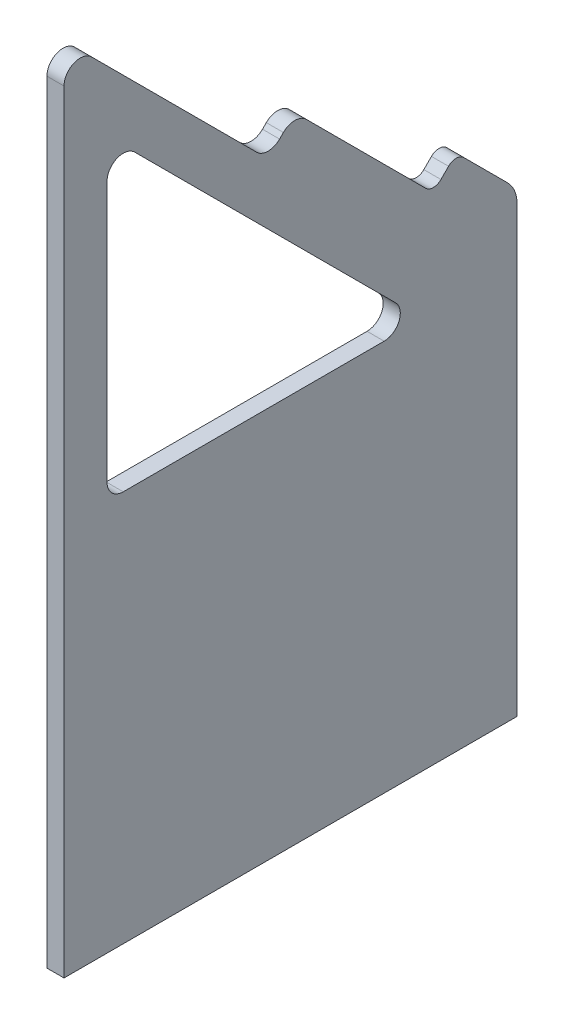
ISO-10303-21;
HEADER;
FILE_DESCRIPTION(('STEP AP214'),'2;1');
FILE_NAME('part.step','',(''),(''),'','','');
FILE_SCHEMA(('AUTOMOTIVE_DESIGN { 1 0 10303 214 1 1 1 1 }'));
ENDSEC;
DATA;
#1=APPLICATION_CONTEXT('core data for automotive mechanical design processes');
#2=APPLICATION_PROTOCOL_DEFINITION('international standard','automotive_design',2000,#1);
#3=PRODUCT_CONTEXT('',#1,'mechanical');
#4=PRODUCT('Part','Part','',(#3));
#5=PRODUCT_RELATED_PRODUCT_CATEGORY('part','',(#4));
#6=PRODUCT_DEFINITION_FORMATION('','',#4);
#7=PRODUCT_DEFINITION_CONTEXT('part definition',#1,'design');
#8=PRODUCT_DEFINITION('design','',#6,#7);
#9=PRODUCT_DEFINITION_SHAPE('','',#8);
#10=(LENGTH_UNIT() NAMED_UNIT(*) SI_UNIT(.MILLI.,.METRE.));
#11=(NAMED_UNIT(*) PLANE_ANGLE_UNIT() SI_UNIT($,.RADIAN.));
#12=(NAMED_UNIT(*) SI_UNIT($,.STERADIAN.) SOLID_ANGLE_UNIT());
#13=UNCERTAINTY_MEASURE_WITH_UNIT(LENGTH_MEASURE(1.E-05),#10,'distance_accuracy_value','');
#14=(GEOMETRIC_REPRESENTATION_CONTEXT(3) GLOBAL_UNCERTAINTY_ASSIGNED_CONTEXT((#13)) GLOBAL_UNIT_ASSIGNED_CONTEXT((#10,
#11,#12)) REPRESENTATION_CONTEXT('',''));
#15=CARTESIAN_POINT('',(0.,0.,0.));
#16=DIRECTION('',(0.,0.,1.));
#17=DIRECTION('',(1.,0.,0.));
#18=AXIS2_PLACEMENT_3D('',#15,#16,#17);
#19=CARTESIAN_POINT('',(3.175,150.710678118654,42.0728534805994));
#20=DIRECTION('',(0.,0.,-1.));
#21=DIRECTION('',(0.,1.,0.));
#22=AXIS2_PLACEMENT_3D('',#19,#20,#21);
#23=PLANE('',#22);
#24=DIRECTION('',(0.,-1.,0.));
#25=VECTOR('',#24,1.);
#26=CARTESIAN_POINT('',(3.175,150.710678118654,42.0728534805994));
#27=LINE('',#26,#25);
#28=CARTESIAN_POINT('',(3.175,143.468037431535,42.0728534805994));
#29=VERTEX_POINT('',#28);
#30=CARTESIAN_POINT('',(3.175,0.,42.0728534805994));
#31=VERTEX_POINT('',#30);
#32=EDGE_CURVE('E179',#29,#31,#27,.T.);
#33=ORIENTED_EDGE('',*,*,#32,.F.);
#34=DIRECTION('',(-1.,0.,0.));
#35=VECTOR('',#34,1.);
#36=CARTESIAN_POINT('',(3.175,143.468037431535,42.0728534805994));
#37=LINE('',#36,#35);
#38=CARTESIAN_POINT('',(0.,143.468037431535,42.0728534805994));
#39=VERTEX_POINT('',#38);
#40=EDGE_CURVE('E250',#29,#39,#37,.T.);
#41=ORIENTED_EDGE('',*,*,#40,.T.);
#42=DIRECTION('',(0.,-1.,0.));
#43=VECTOR('',#42,1.);
#44=CARTESIAN_POINT('',(0.,150.710678118654,42.0728534805994));
#45=LINE('',#44,#43);
#46=CARTESIAN_POINT('',(0.,0.,42.0728534805994));
#47=VERTEX_POINT('',#46);
#48=EDGE_CURVE('E207',#39,#47,#45,.T.);
#49=ORIENTED_EDGE('',*,*,#48,.T.);
#50=DIRECTION('',(-1.,0.,0.));
#51=VECTOR('',#50,1.);
#52=CARTESIAN_POINT('',(3.175,0.,42.0728534805994));
#53=LINE('',#52,#51);
#54=EDGE_CURVE('E199',#31,#47,#53,.T.);
#55=ORIENTED_EDGE('',*,*,#54,.F.);
#56=EDGE_LOOP('',(#33,#41,#49,#55));
#57=FACE_BOUND('',#56,.T.);
#58=ADVANCED_FACE('F41',(#57),#23,.F.);
#59=CARTESIAN_POINT('',(3.175,0.,42.0728534805994));
#60=DIRECTION('',(0.,1.,0.));
#61=DIRECTION('',(0.,0.,1.));
#62=AXIS2_PLACEMENT_3D('',#59,#60,#61);
#63=PLANE('',#62);
#64=DIRECTION('',(0.,0.,-1.));
#65=VECTOR('',#64,1.);
#66=CARTESIAN_POINT('',(0.,0.,42.0728534805994));
#67=LINE('',#66,#65);
#68=CARTESIAN_POINT('',(0.,0.,-42.0728534805994));
#69=VERTEX_POINT('',#68);
#70=EDGE_CURVE('E393',#47,#69,#67,.T.);
#71=ORIENTED_EDGE('',*,*,#70,.T.);
#72=DIRECTION('',(-1.,0.,0.));
#73=VECTOR('',#72,1.);
#74=CARTESIAN_POINT('',(3.175,0.,-42.0728534805994));
#75=LINE('',#74,#73);
#76=CARTESIAN_POINT('',(3.175,0.,-42.0728534805994));
#77=VERTEX_POINT('',#76);
#78=EDGE_CURVE('E201',#77,#69,#75,.T.);
#79=ORIENTED_EDGE('',*,*,#78,.F.);
#80=DIRECTION('',(0.,0.,-1.));
#81=VECTOR('',#80,1.);
#82=CARTESIAN_POINT('',(3.175,0.,42.0728534805994));
#83=LINE('',#82,#81);
#84=EDGE_CURVE('E185',#31,#77,#83,.T.);
#85=ORIENTED_EDGE('',*,*,#84,.F.);
#86=ORIENTED_EDGE('',*,*,#54,.T.);
#87=EDGE_LOOP('',(#71,#79,#85,#86));
#88=FACE_BOUND('',#87,.T.);
#89=ADVANCED_FACE('F198',(#88),#63,.F.);
#90=CARTESIAN_POINT('',(3.175,0.,-42.0728534805994));
#91=DIRECTION('',(0.,0.,1.));
#92=DIRECTION('',(0.,-1.,0.));
#93=AXIS2_PLACEMENT_3D('',#90,#91,#92);
#94=PLANE('',#93);
#95=DIRECTION('',(0.,1.,0.));
#96=VECTOR('',#95,1.);
#97=CARTESIAN_POINT('',(0.,0.,-42.0728534805994));
#98=LINE('',#97,#96);
#99=CARTESIAN_POINT('',(0.,82.4644660940667,-42.0728534805994));
#100=VERTEX_POINT('',#99);
#101=EDGE_CURVE('E396',#69,#100,#98,.T.);
#102=ORIENTED_EDGE('',*,*,#101,.T.);
#103=DIRECTION('',(-1.,0.,0.));
#104=VECTOR('',#103,1.);
#105=CARTESIAN_POINT('',(3.175,82.4644660940667,-42.0728534805994));
#106=LINE('',#105,#104);
#107=CARTESIAN_POINT('',(3.175,82.4644660940667,-42.0728534805994));
#108=VERTEX_POINT('',#107);
#109=EDGE_CURVE('E223',#100,#108,#106,.F.);
#110=ORIENTED_EDGE('',*,*,#109,.T.);
#111=DIRECTION('',(0.,1.,0.));
#112=VECTOR('',#111,1.);
#113=CARTESIAN_POINT('',(3.175,0.,-42.0728534805994));
#114=LINE('',#113,#112);
#115=EDGE_CURVE('E204',#77,#108,#114,.T.);
#116=ORIENTED_EDGE('',*,*,#115,.F.);
#117=ORIENTED_EDGE('',*,*,#78,.T.);
#118=EDGE_LOOP('',(#102,#110,#116,#117));
#119=FACE_BOUND('',#118,.T.);
#120=ADVANCED_FACE('F429',(#119),#94,.F.);
#121=CARTESIAN_POINT('',(3.175,84.9497474683053,-42.0728534805994));
#122=DIRECTION('',(0.,-0.707106781186558,0.707106781186537));
#123=DIRECTION('',(0.,-0.707106781186537,-0.707106781186558));
#124=AXIS2_PLACEMENT_3D('',#121,#122,#123);
#125=PLANE('',#124);
#126=DIRECTION('',(0.,0.707106781186537,0.707106781186558));
#127=VECTOR('',#126,1.);
#128=CARTESIAN_POINT('',(0.,84.9497474683053,-42.0728534805994));
#129=LINE('',#128,#127);
#130=CARTESIAN_POINT('',(0.,86.707106781186,-40.3154941677186));
#131=VERTEX_POINT('',#130);
#132=CARTESIAN_POINT('',(0.,94.8492424049166,-32.1733585439878));
#133=VERTEX_POINT('',#132);
#134=EDGE_CURVE('E400',#131,#133,#129,.T.);
#135=ORIENTED_EDGE('',*,*,#134,.T.);
#136=DIRECTION('',(1.,0.,0.));
#137=VECTOR('',#136,1.);
#138=CARTESIAN_POINT('',(3.175,94.8492424049166,-32.1733585439878));
#139=LINE('',#138,#137);
#140=CARTESIAN_POINT('',(3.175,94.8492424049166,-32.1733585439878));
#141=VERTEX_POINT('',#140);
#142=EDGE_CURVE('E292',#133,#141,#139,.T.);
#143=ORIENTED_EDGE('',*,*,#142,.T.);
#144=DIRECTION('',(0.,0.707106781186537,0.707106781186558));
#145=VECTOR('',#144,1.);
#146=CARTESIAN_POINT('',(3.175,84.9497474683053,-42.0728534805994));
#147=LINE('',#146,#145);
#148=CARTESIAN_POINT('',(3.175,86.707106781186,-40.3154941677186));
#149=VERTEX_POINT('',#148);
#150=EDGE_CURVE('E384',#149,#141,#147,.T.);
#151=ORIENTED_EDGE('',*,*,#150,.F.);
#152=DIRECTION('',(-1.,0.,0.));
#153=VECTOR('',#152,1.);
#154=CARTESIAN_POINT('',(3.175,86.707106781186,-40.3154941677186));
#155=LINE('',#154,#153);
#156=EDGE_CURVE('E210',#149,#131,#155,.T.);
#157=ORIENTED_EDGE('',*,*,#156,.T.);
#158=EDGE_LOOP('',(#135,#143,#151,#157));
#159=FACE_BOUND('',#158,.T.);
#160=ADVANCED_FACE('F480',(#159),#125,.F.);
#161=CARTESIAN_POINT('',(3.175,96.2634559672896,-30.7591449816147));
#162=DIRECTION('',(0.,-0.70710678118655,-0.707106781186545));
#163=DIRECTION('',(0.,0.707106781186545,-0.70710678118655));
#164=AXIS2_PLACEMENT_3D('',#161,#162,#163);
#165=PLANE('',#164);
#166=DIRECTION('',(0.,-0.707106781186545,0.70710678118655));
#167=VECTOR('',#166,1.);
#168=CARTESIAN_POINT('',(0.,96.2634559672896,-30.7591449816147));
#169=LINE('',#168,#167);
#170=CARTESIAN_POINT('',(0.,94.8492424049166,-29.3449314192416));
#171=VERTEX_POINT('',#170);
#172=CARTESIAN_POINT('',(0.,93.4350288425434,-27.9307178568685));
#173=VERTEX_POINT('',#172);
#174=EDGE_CURVE('E404',#171,#173,#169,.T.);
#175=ORIENTED_EDGE('',*,*,#174,.T.);
#176=DIRECTION('',(1.,0.,0.));
#177=VECTOR('',#176,1.);
#178=CARTESIAN_POINT('',(3.175,93.4350288425434,-27.9307178568685));
#179=LINE('',#178,#177);
#180=CARTESIAN_POINT('',(3.175,93.4350288425434,-27.9307178568685));
#181=VERTEX_POINT('',#180);
#182=EDGE_CURVE('E284',#173,#181,#179,.T.);
#183=ORIENTED_EDGE('',*,*,#182,.T.);
#184=DIRECTION('',(0.,-0.707106781186545,0.70710678118655));
#185=VECTOR('',#184,1.);
#186=CARTESIAN_POINT('',(3.175,96.2634559672896,-30.7591449816147));
#187=LINE('',#186,#185);
#188=CARTESIAN_POINT('',(3.175,94.8492424049166,-29.3449314192416));
#189=VERTEX_POINT('',#188);
#190=EDGE_CURVE('E337',#189,#181,#187,.T.);
#191=ORIENTED_EDGE('',*,*,#190,.F.);
#192=DIRECTION('',(1.,0.,0.));
#193=VECTOR('',#192,1.);
#194=CARTESIAN_POINT('',(3.175,94.8492424049166,-29.3449314192416));
#195=LINE('',#194,#193);
#196=EDGE_CURVE('E281',#189,#171,#195,.F.);
#197=ORIENTED_EDGE('',*,*,#196,.T.);
#198=EDGE_LOOP('',(#175,#183,#191,#197));
#199=FACE_BOUND('',#198,.T.);
#200=ADVANCED_FACE('F474',(#199),#165,.F.);
#201=CARTESIAN_POINT('',(3.175,79.9999999999991,-28.637824638055));
#202=DIRECTION('',(0.,-0.707106781186544,0.707106781186551));
#203=DIRECTION('',(0.,-0.707106781186551,-0.707106781186544));
#204=AXIS2_PLACEMENT_3D('',#201,#202,#203);
#205=PLANE('',#204);
#206=DIRECTION('',(0.,0.707106781186551,0.707106781186544));
#207=VECTOR('',#206,1.);
#208=CARTESIAN_POINT('',(3.175,79.9999999999991,-28.637824638055));
#209=LINE('',#208,#207);
#210=CARTESIAN_POINT('',(3.175,114.915999231106,6.27817459305203));
#211=VERTEX_POINT('',#210);
#212=CARTESIAN_POINT('',(3.175,145.589357775094,36.9515331370397));
#213=VERTEX_POINT('',#212);
#214=EDGE_CURVE('E217',#211,#213,#209,.T.);
#215=ORIENTED_EDGE('',*,*,#214,.F.);
#216=DIRECTION('',(1.,0.,0.));
#217=VECTOR('',#216,1.);
#218=CARTESIAN_POINT('',(3.175,114.915999231106,6.27817459305203));
#219=LINE('',#218,#217);
#220=CARTESIAN_POINT('',(0.,114.915999231106,6.27817459305203));
#221=VERTEX_POINT('',#220);
#222=EDGE_CURVE('E315',#211,#221,#219,.F.);
#223=ORIENTED_EDGE('',*,*,#222,.T.);
#224=DIRECTION('',(0.,0.707106781186551,0.707106781186544));
#225=VECTOR('',#224,1.);
#226=CARTESIAN_POINT('',(0.,79.9999999999991,-28.637824638055));
#227=LINE('',#226,#225);
#228=CARTESIAN_POINT('',(0.,145.589357775094,36.9515331370397));
#229=VERTEX_POINT('',#228);
#230=EDGE_CURVE('E194',#221,#229,#227,.T.);
#231=ORIENTED_EDGE('',*,*,#230,.T.);
#232=DIRECTION('',(-1.,0.,0.));
#233=VECTOR('',#232,1.);
#234=CARTESIAN_POINT('',(3.175,145.589357775094,36.9515331370397));
#235=LINE('',#234,#233);
#236=EDGE_CURVE('E257',#229,#213,#235,.F.);
#237=ORIENTED_EDGE('',*,*,#236,.T.);
#238=EDGE_LOOP('',(#215,#223,#231,#237));
#239=FACE_BOUND('',#238,.T.);
#240=ADVANCED_FACE('F333',(#239),#205,.F.);
#241=CARTESIAN_POINT('',(3.175,0.,0.));
#242=DIRECTION('',(1.,0.,0.));
#243=DIRECTION('',(0.,0.,-1.));
#244=AXIS2_PLACEMENT_3D('',#241,#242,#243);
#245=PLANE('',#244);
#246=DIRECTION('',(0.,0.707106781186547,0.707106781186548));
#247=VECTOR('',#246,1.);
#248=CARTESIAN_POINT('',(3.175,92.0208152801703,-26.5165042944954));
#249=LINE('',#248,#247);
#250=CARTESIAN_POINT('',(3.175,93.4350288425434,-25.1022907321223));
#251=VERTEX_POINT('',#250);
#252=CARTESIAN_POINT('',(3.175,115.623106012293,-2.91421356237295));
#253=VERTEX_POINT('',#252);
#254=EDGE_CURVE('E358',#251,#253,#249,.T.);
#255=ORIENTED_EDGE('',*,*,#254,.T.);
#256=CARTESIAN_POINT('',(3.175,113.501785668733,-0.792893218813307));
#257=DIRECTION('',(1.,0.,0.));
#258=DIRECTION('',(0.,0.,-1.));
#259=AXIS2_PLACEMENT_3D('',#256,#257,#258);
#260=CIRCLE('',#259,3.);
#261=CARTESIAN_POINT('',(3.175,115.623106012293,1.32842712474633));
#262=VERTEX_POINT('',#261);
#263=EDGE_CURVE('E65',#253,#262,#260,.T.);
#264=ORIENTED_EDGE('',*,*,#263,.T.);
#265=DIRECTION('',(0.,-0.707106781186547,0.707106781186548));
#266=VECTOR('',#265,1.);
#267=CARTESIAN_POINT('',(3.175,117.744426355852,-0.792893218813311));
#268=LINE('',#267,#266);
#269=CARTESIAN_POINT('',(3.175,114.915999231106,2.03553390593272));
#270=VERTEX_POINT('',#269);
#271=EDGE_CURVE('E328',#262,#270,#268,.T.);
#272=ORIENTED_EDGE('',*,*,#271,.T.);
#273=CARTESIAN_POINT('',(3.175,117.037319574666,4.15685424949237));
#274=DIRECTION('',(1.,0.,0.));
#275=DIRECTION('',(0.,0.,-1.));
#276=AXIS2_PLACEMENT_3D('',#273,#274,#275);
#277=CIRCLE('',#276,3.);
#278=EDGE_CURVE('E50',#270,#211,#277,.F.);
#279=ORIENTED_EDGE('',*,*,#278,.T.);
#280=ORIENTED_EDGE('',*,*,#214,.T.);
#281=CARTESIAN_POINT('',(3.175,143.468037431535,39.0728534805994));
#282=DIRECTION('',(1.,0.,0.));
#283=DIRECTION('',(0.,0.,-1.));
#284=AXIS2_PLACEMENT_3D('',#281,#282,#283);
#285=CIRCLE('',#284,3.);
#286=EDGE_CURVE('E188',#213,#29,#285,.T.);
#287=ORIENTED_EDGE('',*,*,#286,.T.);
#288=ORIENTED_EDGE('',*,*,#32,.T.);
#289=ORIENTED_EDGE('',*,*,#84,.T.);
#290=ORIENTED_EDGE('',*,*,#115,.T.);
#291=CARTESIAN_POINT('',(3.175,82.4644660940667,-36.0728534805994));
#292=DIRECTION('',(1.,0.,0.));
#293=DIRECTION('',(0.,0.,-1.));
#294=AXIS2_PLACEMENT_3D('',#291,#292,#293);
#295=CIRCLE('',#294,6.);
#296=EDGE_CURVE('E226',#108,#149,#295,.T.);
#297=ORIENTED_EDGE('',*,*,#296,.T.);
#298=ORIENTED_EDGE('',*,*,#150,.T.);
#299=CARTESIAN_POINT('',(3.175,93.4350288425435,-30.7591449816147));
#300=DIRECTION('',(1.,0.,0.));
#301=DIRECTION('',(0.,0.,-1.));
#302=AXIS2_PLACEMENT_3D('',#299,#300,#301);
#303=CIRCLE('',#302,2.);
#304=EDGE_CURVE('E296',#141,#189,#303,.T.);
#305=ORIENTED_EDGE('',*,*,#304,.T.);
#306=ORIENTED_EDGE('',*,*,#190,.T.);
#307=CARTESIAN_POINT('',(3.175,94.8492424049165,-26.5165042944954));
#308=DIRECTION('',(1.,0.,0.));
#309=DIRECTION('',(0.,0.,-1.));
#310=AXIS2_PLACEMENT_3D('',#307,#308,#309);
#311=CIRCLE('',#310,2.);
#312=EDGE_CURVE('E302',#181,#251,#311,.F.);
#313=ORIENTED_EDGE('',*,*,#312,.T.);
#314=EDGE_LOOP('',(#255,#264,#272,#279,#280,#287,#288,#289,#290,#297,#298,#305,#306,#313));
#315=FACE_BOUND('',#314,.T.);
#316=DIRECTION('',(0.,0.707106781186547,0.707106781186548));
#317=VECTOR('',#316,1.);
#318=CARTESIAN_POINT('',(3.175,131.396969619669,34.0728534805994));
#319=LINE('',#318,#317);
#320=CARTESIAN_POINT('',(3.175,77.8213203435596,-19.5027957955097));
#321=VERTEX_POINT('',#320);
#322=CARTESIAN_POINT('',(3.175,126.275649276109,28.9515331370397));
#323=VERTEX_POINT('',#322);
#324=EDGE_CURVE('E348',#321,#323,#319,.T.);
#325=ORIENTED_EDGE('',*,*,#324,.F.);
#326=CARTESIAN_POINT('',(3.175,75.7,-17.38147545195));
#327=DIRECTION('',(1.,0.,0.));
#328=DIRECTION('',(0.,0.,-1.));
#329=AXIS2_PLACEMENT_3D('',#326,#327,#328);
#330=CIRCLE('',#329,3.);
#331=CARTESIAN_POINT('',(3.175,72.7,-17.38147545195));
#332=VERTEX_POINT('',#331);
#333=EDGE_CURVE('E263',#321,#332,#330,.F.);
#334=ORIENTED_EDGE('',*,*,#333,.T.);
#335=DIRECTION('',(0.,0.,-1.));
#336=VECTOR('',#335,1.);
#337=CARTESIAN_POINT('',(3.175,72.7,-24.6241161390693));
#338=LINE('',#337,#336);
#339=CARTESIAN_POINT('',(3.175,72.7,31.0728534805994));
#340=VERTEX_POINT('',#339);
#341=EDGE_CURVE('E368',#340,#332,#338,.T.);
#342=ORIENTED_EDGE('',*,*,#341,.F.);
#343=CARTESIAN_POINT('',(3.175,75.7,31.0728534805994));
#344=DIRECTION('',(1.,0.,0.));
#345=DIRECTION('',(0.,0.,-1.));
#346=AXIS2_PLACEMENT_3D('',#343,#344,#345);
#347=CIRCLE('',#346,3.);
#348=CARTESIAN_POINT('',(3.175,75.7,34.0728534805994));
#349=VERTEX_POINT('',#348);
#350=EDGE_CURVE('E269',#340,#349,#347,.F.);
#351=ORIENTED_EDGE('',*,*,#350,.T.);
#352=DIRECTION('',(0.,-1.,0.));
#353=VECTOR('',#352,1.);
#354=CARTESIAN_POINT('',(3.175,72.7,34.0728534805994));
#355=LINE('',#354,#353);
#356=CARTESIAN_POINT('',(3.175,124.154328932549,34.0728534805994));
#357=VERTEX_POINT('',#356);
#358=EDGE_CURVE('E354',#357,#349,#355,.T.);
#359=ORIENTED_EDGE('',*,*,#358,.F.);
#360=CARTESIAN_POINT('',(3.175,124.154328932549,31.0728534805994));
#361=DIRECTION('',(1.,0.,0.));
#362=DIRECTION('',(0.,0.,-1.));
#363=AXIS2_PLACEMENT_3D('',#360,#361,#362);
#364=CIRCLE('',#363,3.);
#365=EDGE_CURVE('E275',#357,#323,#364,.F.);
#366=ORIENTED_EDGE('',*,*,#365,.T.);
#367=EDGE_LOOP('',(#325,#334,#342,#351,#359,#366));
#368=FACE_BOUND('',#367,.T.);
#369=ADVANCED_FACE('F182',(#315,#368),#245,.T.);
#370=CARTESIAN_POINT('',(0.,0.,0.));
#371=DIRECTION('',(1.,0.,0.));
#372=DIRECTION('',(0.,0.,-1.));
#373=AXIS2_PLACEMENT_3D('',#370,#371,#372);
#374=PLANE('',#373);
#375=DIRECTION('',(0.,0.707106781186547,-0.707106781186548));
#376=VECTOR('',#375,1.);
#377=CARTESIAN_POINT('',(0.,117.744426355852,-0.792893218813311));
#378=LINE('',#377,#376);
#379=CARTESIAN_POINT('',(0.,114.915999231106,2.03553390593272));
#380=VERTEX_POINT('',#379);
#381=CARTESIAN_POINT('',(0.,115.623106012293,1.32842712474633));
#382=VERTEX_POINT('',#381);
#383=EDGE_CURVE('E344',#380,#382,#378,.T.);
#384=ORIENTED_EDGE('',*,*,#383,.T.);
#385=CARTESIAN_POINT('',(0.,113.501785668733,-0.792893218813307));
#386=DIRECTION('',(1.,0.,0.));
#387=DIRECTION('',(0.,0.,-1.));
#388=AXIS2_PLACEMENT_3D('',#385,#386,#387);
#389=CIRCLE('',#388,3.);
#390=CARTESIAN_POINT('',(0.,115.623106012293,-2.91421356237295));
#391=VERTEX_POINT('',#390);
#392=EDGE_CURVE('E57',#382,#391,#389,.F.);
#393=ORIENTED_EDGE('',*,*,#392,.T.);
#394=DIRECTION('',(0.,-0.707106781186547,-0.707106781186548));
#395=VECTOR('',#394,1.);
#396=CARTESIAN_POINT('',(0.,92.0208152801703,-26.5165042944954));
#397=LINE('',#396,#395);
#398=CARTESIAN_POINT('',(0.,93.4350288425434,-25.1022907321223));
#399=VERTEX_POINT('',#398);
#400=EDGE_CURVE('E349',#391,#399,#397,.T.);
#401=ORIENTED_EDGE('',*,*,#400,.T.);
#402=CARTESIAN_POINT('',(0.,94.8492424049165,-26.5165042944954));
#403=DIRECTION('',(1.,0.,0.));
#404=DIRECTION('',(0.,0.,-1.));
#405=AXIS2_PLACEMENT_3D('',#402,#403,#404);
#406=CIRCLE('',#405,2.);
#407=EDGE_CURVE('E305',#399,#173,#406,.T.);
#408=ORIENTED_EDGE('',*,*,#407,.T.);
#409=ORIENTED_EDGE('',*,*,#174,.F.);
#410=CARTESIAN_POINT('',(0.,93.4350288425435,-30.7591449816147));
#411=DIRECTION('',(1.,0.,0.));
#412=DIRECTION('',(0.,0.,-1.));
#413=AXIS2_PLACEMENT_3D('',#410,#411,#412);
#414=CIRCLE('',#413,2.);
#415=EDGE_CURVE('E299',#171,#133,#414,.F.);
#416=ORIENTED_EDGE('',*,*,#415,.T.);
#417=ORIENTED_EDGE('',*,*,#134,.F.);
#418=CARTESIAN_POINT('',(0.,82.4644660940667,-36.0728534805994));
#419=DIRECTION('',(1.,0.,0.));
#420=DIRECTION('',(0.,0.,-1.));
#421=AXIS2_PLACEMENT_3D('',#418,#419,#420);
#422=CIRCLE('',#421,6.);
#423=EDGE_CURVE('E215',#131,#100,#422,.F.);
#424=ORIENTED_EDGE('',*,*,#423,.T.);
#425=ORIENTED_EDGE('',*,*,#101,.F.);
#426=ORIENTED_EDGE('',*,*,#70,.F.);
#427=ORIENTED_EDGE('',*,*,#48,.F.);
#428=CARTESIAN_POINT('',(0.,143.468037431535,39.0728534805994));
#429=DIRECTION('',(1.,0.,0.));
#430=DIRECTION('',(0.,0.,-1.));
#431=AXIS2_PLACEMENT_3D('',#428,#429,#430);
#432=CIRCLE('',#431,3.);
#433=EDGE_CURVE('E253',#39,#229,#432,.F.);
#434=ORIENTED_EDGE('',*,*,#433,.T.);
#435=ORIENTED_EDGE('',*,*,#230,.F.);
#436=CARTESIAN_POINT('',(0.,117.037319574666,4.15685424949237));
#437=DIRECTION('',(1.,0.,0.));
#438=DIRECTION('',(0.,0.,-1.));
#439=AXIS2_PLACEMENT_3D('',#436,#437,#438);
#440=CIRCLE('',#439,3.);
#441=EDGE_CURVE('E11',#221,#380,#440,.T.);
#442=ORIENTED_EDGE('',*,*,#441,.T.);
#443=EDGE_LOOP('',(#384,#393,#401,#408,#409,#416,#417,#424,#425,#426,#427,#434,#435,#442));
#444=FACE_BOUND('',#443,.T.);
#445=DIRECTION('',(0.,-1.,0.));
#446=VECTOR('',#445,1.);
#447=CARTESIAN_POINT('',(0.,72.7,34.0728534805994));
#448=LINE('',#447,#446);
#449=CARTESIAN_POINT('',(0.,124.154328932549,34.0728534805994));
#450=VERTEX_POINT('',#449);
#451=CARTESIAN_POINT('',(0.,75.7,34.0728534805994));
#452=VERTEX_POINT('',#451);
#453=EDGE_CURVE('E367',#450,#452,#448,.T.);
#454=ORIENTED_EDGE('',*,*,#453,.T.);
#455=CARTESIAN_POINT('',(0.,75.7,31.0728534805994));
#456=DIRECTION('',(1.,0.,0.));
#457=DIRECTION('',(0.,0.,-1.));
#458=AXIS2_PLACEMENT_3D('',#455,#456,#457);
#459=CIRCLE('',#458,3.);
#460=CARTESIAN_POINT('',(0.,72.7,31.0728534805994));
#461=VERTEX_POINT('',#460);
#462=EDGE_CURVE('E272',#452,#461,#459,.T.);
#463=ORIENTED_EDGE('',*,*,#462,.T.);
#464=DIRECTION('',(0.,0.,-1.));
#465=VECTOR('',#464,1.);
#466=CARTESIAN_POINT('',(0.,72.7,-24.6241161390693));
#467=LINE('',#466,#465);
#468=CARTESIAN_POINT('',(0.,72.7,-17.38147545195));
#469=VERTEX_POINT('',#468);
#470=EDGE_CURVE('E372',#461,#469,#467,.T.);
#471=ORIENTED_EDGE('',*,*,#470,.T.);
#472=CARTESIAN_POINT('',(0.,75.7,-17.38147545195));
#473=DIRECTION('',(1.,0.,0.));
#474=DIRECTION('',(0.,0.,-1.));
#475=AXIS2_PLACEMENT_3D('',#472,#473,#474);
#476=CIRCLE('',#475,3.);
#477=CARTESIAN_POINT('',(0.,77.8213203435596,-19.5027957955097));
#478=VERTEX_POINT('',#477);
#479=EDGE_CURVE('E266',#469,#478,#476,.T.);
#480=ORIENTED_EDGE('',*,*,#479,.T.);
#481=DIRECTION('',(0.,0.707106781186547,0.707106781186548));
#482=VECTOR('',#481,1.);
#483=CARTESIAN_POINT('',(0.,131.396969619669,34.0728534805994));
#484=LINE('',#483,#482);
#485=CARTESIAN_POINT('',(0.,126.275649276109,28.9515331370397));
#486=VERTEX_POINT('',#485);
#487=EDGE_CURVE('E363',#478,#486,#484,.T.);
#488=ORIENTED_EDGE('',*,*,#487,.T.);
#489=CARTESIAN_POINT('',(0.,124.154328932549,31.0728534805994));
#490=DIRECTION('',(1.,0.,0.));
#491=DIRECTION('',(0.,0.,-1.));
#492=AXIS2_PLACEMENT_3D('',#489,#490,#491);
#493=CIRCLE('',#492,3.);
#494=EDGE_CURVE('E278',#486,#450,#493,.T.);
#495=ORIENTED_EDGE('',*,*,#494,.T.);
#496=EDGE_LOOP('',(#454,#463,#471,#480,#488,#495));
#497=FACE_BOUND('',#496,.T.);
#498=ADVANCED_FACE('F342',(#444,#497),#374,.F.);
#499=CARTESIAN_POINT('',(3.175,82.4644660940667,-36.0728534805994));
#500=DIRECTION('',(-1.,0.,0.));
#501=DIRECTION('',(0.,0.,1.));
#502=AXIS2_PLACEMENT_3D('',#499,#500,#501);
#503=CYLINDRICAL_SURFACE('',#502,6.);
#504=ORIENTED_EDGE('',*,*,#296,.F.);
#505=ORIENTED_EDGE('',*,*,#109,.F.);
#506=ORIENTED_EDGE('',*,*,#423,.F.);
#507=ORIENTED_EDGE('',*,*,#156,.F.);
#508=EDGE_LOOP('',(#504,#505,#506,#507));
#509=FACE_BOUND('',#508,.T.);
#510=ADVANCED_FACE('F433',(#509),#503,.T.);
#511=CARTESIAN_POINT('',(0.,131.396969619669,34.0728534805994));
#512=DIRECTION('',(0.,0.707106781186548,-0.707106781186547));
#513=DIRECTION('',(0.,0.707106781186547,0.707106781186548));
#514=AXIS2_PLACEMENT_3D('',#511,#512,#513);
#515=PLANE('',#514);
#516=ORIENTED_EDGE('',*,*,#487,.F.);
#517=DIRECTION('',(1.,0.,0.));
#518=VECTOR('',#517,1.);
#519=CARTESIAN_POINT('',(3.175,77.8213203435596,-19.5027957955097));
#520=LINE('',#519,#518);
#521=EDGE_CURVE('E232',#478,#321,#520,.T.);
#522=ORIENTED_EDGE('',*,*,#521,.T.);
#523=ORIENTED_EDGE('',*,*,#324,.T.);
#524=DIRECTION('',(1.,0.,0.));
#525=VECTOR('',#524,1.);
#526=CARTESIAN_POINT('',(0.,126.275649276109,28.9515331370397));
#527=LINE('',#526,#525);
#528=EDGE_CURVE('E229',#323,#486,#527,.F.);
#529=ORIENTED_EDGE('',*,*,#528,.T.);
#530=EDGE_LOOP('',(#516,#522,#523,#529));
#531=FACE_BOUND('',#530,.T.);
#532=ADVANCED_FACE('F436',(#531),#515,.F.);
#533=CARTESIAN_POINT('',(0.,72.7,-24.6241161390693));
#534=DIRECTION('',(0.,-1.,0.));
#535=DIRECTION('',(0.,0.,-1.));
#536=AXIS2_PLACEMENT_3D('',#533,#534,#535);
#537=PLANE('',#536);
#538=ORIENTED_EDGE('',*,*,#341,.T.);
#539=DIRECTION('',(1.,0.,0.));
#540=VECTOR('',#539,1.);
#541=CARTESIAN_POINT('',(0.,72.7,-17.38147545195));
#542=LINE('',#541,#540);
#543=EDGE_CURVE('E240',#332,#469,#542,.F.);
#544=ORIENTED_EDGE('',*,*,#543,.T.);
#545=ORIENTED_EDGE('',*,*,#470,.F.);
#546=DIRECTION('',(1.,0.,0.));
#547=VECTOR('',#546,1.);
#548=CARTESIAN_POINT('',(3.175,72.7,31.0728534805994));
#549=LINE('',#548,#547);
#550=EDGE_CURVE('E236',#461,#340,#549,.T.);
#551=ORIENTED_EDGE('',*,*,#550,.T.);
#552=EDGE_LOOP('',(#538,#544,#545,#551));
#553=FACE_BOUND('',#552,.T.);
#554=ADVANCED_FACE('F454',(#553),#537,.F.);
#555=CARTESIAN_POINT('',(0.,72.7,34.0728534805994));
#556=DIRECTION('',(0.,0.,1.));
#557=DIRECTION('',(1.,0.,0.));
#558=AXIS2_PLACEMENT_3D('',#555,#556,#557);
#559=PLANE('',#558);
#560=ORIENTED_EDGE('',*,*,#358,.T.);
#561=DIRECTION('',(1.,0.,0.));
#562=VECTOR('',#561,1.);
#563=CARTESIAN_POINT('',(0.,75.7,34.0728534805994));
#564=LINE('',#563,#562);
#565=EDGE_CURVE('E247',#349,#452,#564,.F.);
#566=ORIENTED_EDGE('',*,*,#565,.T.);
#567=ORIENTED_EDGE('',*,*,#453,.F.);
#568=DIRECTION('',(1.,0.,0.));
#569=VECTOR('',#568,1.);
#570=CARTESIAN_POINT('',(3.175,124.154328932549,34.0728534805994));
#571=LINE('',#570,#569);
#572=EDGE_CURVE('E243',#450,#357,#571,.T.);
#573=ORIENTED_EDGE('',*,*,#572,.T.);
#574=EDGE_LOOP('',(#560,#566,#567,#573));
#575=FACE_BOUND('',#574,.T.);
#576=ADVANCED_FACE('F441',(#575),#559,.F.);
#577=CARTESIAN_POINT('',(0.,75.7,-17.38147545195));
#578=DIRECTION('',(-1.,0.,0.));
#579=DIRECTION('',(0.,0.,1.));
#580=AXIS2_PLACEMENT_3D('',#577,#578,#579);
#581=CYLINDRICAL_SURFACE('',#580,3.);
#582=ORIENTED_EDGE('',*,*,#479,.F.);
#583=ORIENTED_EDGE('',*,*,#543,.F.);
#584=ORIENTED_EDGE('',*,*,#333,.F.);
#585=ORIENTED_EDGE('',*,*,#521,.F.);
#586=EDGE_LOOP('',(#582,#583,#584,#585));
#587=FACE_BOUND('',#586,.T.);
#588=ADVANCED_FACE('F438',(#587),#581,.F.);
#589=CARTESIAN_POINT('',(0.,75.7,31.0728534805994));
#590=DIRECTION('',(-1.,0.,0.));
#591=DIRECTION('',(0.,0.,1.));
#592=AXIS2_PLACEMENT_3D('',#589,#590,#591);
#593=CYLINDRICAL_SURFACE('',#592,3.);
#594=ORIENTED_EDGE('',*,*,#462,.F.);
#595=ORIENTED_EDGE('',*,*,#565,.F.);
#596=ORIENTED_EDGE('',*,*,#350,.F.);
#597=ORIENTED_EDGE('',*,*,#550,.F.);
#598=EDGE_LOOP('',(#594,#595,#596,#597));
#599=FACE_BOUND('',#598,.T.);
#600=ADVANCED_FACE('F420',(#599),#593,.F.);
#601=CARTESIAN_POINT('',(0.,124.154328932549,31.0728534805994));
#602=DIRECTION('',(-1.,0.,0.));
#603=DIRECTION('',(0.,0.,1.));
#604=AXIS2_PLACEMENT_3D('',#601,#602,#603);
#605=CYLINDRICAL_SURFACE('',#604,3.);
#606=ORIENTED_EDGE('',*,*,#494,.F.);
#607=ORIENTED_EDGE('',*,*,#528,.F.);
#608=ORIENTED_EDGE('',*,*,#365,.F.);
#609=ORIENTED_EDGE('',*,*,#572,.F.);
#610=EDGE_LOOP('',(#606,#607,#608,#609));
#611=FACE_BOUND('',#610,.T.);
#612=ADVANCED_FACE('F411',(#611),#605,.F.);
#613=CARTESIAN_POINT('',(3.175,143.468037431535,39.0728534805994));
#614=DIRECTION('',(-1.,0.,0.));
#615=DIRECTION('',(0.,0.,1.));
#616=AXIS2_PLACEMENT_3D('',#613,#614,#615);
#617=CYLINDRICAL_SURFACE('',#616,3.);
#618=ORIENTED_EDGE('',*,*,#286,.F.);
#619=ORIENTED_EDGE('',*,*,#236,.F.);
#620=ORIENTED_EDGE('',*,*,#433,.F.);
#621=ORIENTED_EDGE('',*,*,#40,.F.);
#622=EDGE_LOOP('',(#618,#619,#620,#621));
#623=FACE_BOUND('',#622,.T.);
#624=ADVANCED_FACE('F409',(#623),#617,.T.);
#625=CARTESIAN_POINT('',(-56.4584406426843,117.744426355852,-0.792893218813311));
#626=DIRECTION('',(0.,0.707106781186548,0.707106781186547));
#627=DIRECTION('',(0.,-0.707106781186547,0.707106781186548));
#628=AXIS2_PLACEMENT_3D('',#625,#626,#627);
#629=PLANE('',#628);
#630=ORIENTED_EDGE('',*,*,#383,.F.);
#631=DIRECTION('',(1.,0.,0.));
#632=VECTOR('',#631,1.);
#633=CARTESIAN_POINT('',(-56.4584406426843,114.915999231106,2.03553390593272));
#634=LINE('',#633,#632);
#635=EDGE_CURVE('E311',#380,#270,#634,.T.);
#636=ORIENTED_EDGE('',*,*,#635,.T.);
#637=ORIENTED_EDGE('',*,*,#271,.F.);
#638=DIRECTION('',(1.,0.,0.));
#639=VECTOR('',#638,1.);
#640=CARTESIAN_POINT('',(-56.4584406426843,115.623106012293,1.32842712474633));
#641=LINE('',#640,#639);
#642=EDGE_CURVE('E308',#262,#382,#641,.F.);
#643=ORIENTED_EDGE('',*,*,#642,.T.);
#644=EDGE_LOOP('',(#630,#636,#637,#643));
#645=FACE_BOUND('',#644,.T.);
#646=ADVANCED_FACE('F346',(#645),#629,.T.);
#647=CARTESIAN_POINT('',(-56.4584406426843,92.0208152801703,-26.5165042944954));
#648=DIRECTION('',(0.,0.707106781186548,-0.707106781186547));
#649=DIRECTION('',(0.,0.707106781186547,0.707106781186548));
#650=AXIS2_PLACEMENT_3D('',#647,#648,#649);
#651=PLANE('',#650);
#652=ORIENTED_EDGE('',*,*,#400,.F.);
#653=DIRECTION('',(1.,0.,0.));
#654=VECTOR('',#653,1.);
#655=CARTESIAN_POINT('',(-56.4584406426843,115.623106012293,-2.91421356237295));
#656=LINE('',#655,#654);
#657=EDGE_CURVE('E318',#391,#253,#656,.T.);
#658=ORIENTED_EDGE('',*,*,#657,.T.);
#659=ORIENTED_EDGE('',*,*,#254,.F.);
#660=DIRECTION('',(1.,0.,0.));
#661=VECTOR('',#660,1.);
#662=CARTESIAN_POINT('',(-56.4584406426843,93.4350288425434,-25.1022907321223));
#663=LINE('',#662,#661);
#664=EDGE_CURVE('E288',#251,#399,#663,.F.);
#665=ORIENTED_EDGE('',*,*,#664,.T.);
#666=EDGE_LOOP('',(#652,#658,#659,#665));
#667=FACE_BOUND('',#666,.T.);
#668=ADVANCED_FACE('F418',(#667),#651,.T.);
#669=CARTESIAN_POINT('',(3.175,94.8492424049165,-26.5165042944954));
#670=DIRECTION('',(1.,0.,0.));
#671=DIRECTION('',(0.,0.,-1.));
#672=AXIS2_PLACEMENT_3D('',#669,#670,#671);
#673=CYLINDRICAL_SURFACE('',#672,2.);
#674=ORIENTED_EDGE('',*,*,#407,.F.);
#675=ORIENTED_EDGE('',*,*,#664,.F.);
#676=ORIENTED_EDGE('',*,*,#312,.F.);
#677=ORIENTED_EDGE('',*,*,#182,.F.);
#678=EDGE_LOOP('',(#674,#675,#676,#677));
#679=FACE_BOUND('',#678,.T.);
#680=ADVANCED_FACE('F504',(#679),#673,.F.);
#681=CARTESIAN_POINT('',(3.175,93.4350288425435,-30.7591449816147));
#682=DIRECTION('',(1.,0.,0.));
#683=DIRECTION('',(0.,0.,-1.));
#684=AXIS2_PLACEMENT_3D('',#681,#682,#683);
#685=CYLINDRICAL_SURFACE('',#684,2.);
#686=ORIENTED_EDGE('',*,*,#415,.F.);
#687=ORIENTED_EDGE('',*,*,#196,.F.);
#688=ORIENTED_EDGE('',*,*,#304,.F.);
#689=ORIENTED_EDGE('',*,*,#142,.F.);
#690=EDGE_LOOP('',(#686,#687,#688,#689));
#691=FACE_BOUND('',#690,.T.);
#692=ADVANCED_FACE('F497',(#691),#685,.T.);
#693=CARTESIAN_POINT('',(-56.4584406426843,117.037319574666,4.15685424949237));
#694=DIRECTION('',(1.,0.,0.));
#695=DIRECTION('',(0.,0.,-1.));
#696=AXIS2_PLACEMENT_3D('',#693,#694,#695);
#697=CYLINDRICAL_SURFACE('',#696,3.);
#698=ORIENTED_EDGE('',*,*,#441,.F.);
#699=ORIENTED_EDGE('',*,*,#222,.F.);
#700=ORIENTED_EDGE('',*,*,#278,.F.);
#701=ORIENTED_EDGE('',*,*,#635,.F.);
#702=EDGE_LOOP('',(#698,#699,#700,#701));
#703=FACE_BOUND('',#702,.T.);
#704=ADVANCED_FACE('F340',(#703),#697,.F.);
#705=CARTESIAN_POINT('',(-56.4584406426843,113.501785668733,-0.792893218813307));
#706=DIRECTION('',(1.,0.,0.));
#707=DIRECTION('',(0.,0.,-1.));
#708=AXIS2_PLACEMENT_3D('',#705,#706,#707);
#709=CYLINDRICAL_SURFACE('',#708,3.);
#710=ORIENTED_EDGE('',*,*,#392,.F.);
#711=ORIENTED_EDGE('',*,*,#642,.F.);
#712=ORIENTED_EDGE('',*,*,#263,.F.);
#713=ORIENTED_EDGE('',*,*,#657,.F.);
#714=EDGE_LOOP('',(#710,#711,#712,#713));
#715=FACE_BOUND('',#714,.T.);
#716=ADVANCED_FACE('F43',(#715),#709,.T.);
#717=CLOSED_SHELL('',(#58,#89,#120,#160,#200,#240,#369,#498,#510,#532,#554,#576,#588,#600,#612,
#624,#646,#668,#680,#692,#704,#716));
#718=MANIFOLD_SOLID_BREP('B2',#717);
#719=ADVANCED_BREP_SHAPE_REPRESENTATION('',(#18,#718),#14);
#720=SHAPE_DEFINITION_REPRESENTATION(#9,#719);
ENDSEC;
END-ISO-10303-21;
